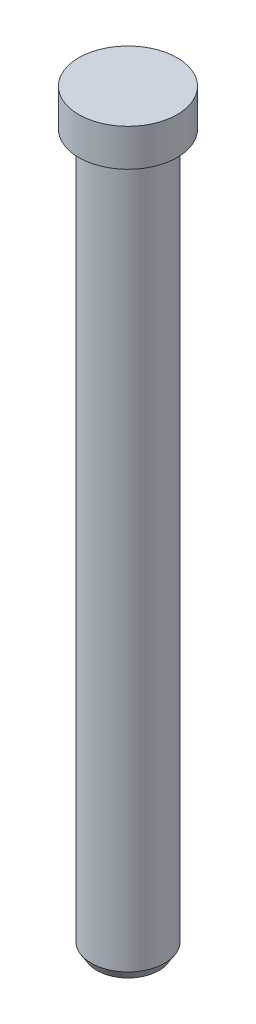
ISO-10303-21;
HEADER;
FILE_DESCRIPTION(('STEP AP214'),'2;1');
FILE_NAME('part.step','',(''),(''),'','','');
FILE_SCHEMA(('AUTOMOTIVE_DESIGN { 1 0 10303 214 1 1 1 1 }'));
ENDSEC;
DATA;
#1=APPLICATION_CONTEXT('core data for automotive mechanical design processes');
#2=APPLICATION_PROTOCOL_DEFINITION('international standard','automotive_design',2000,#1);
#3=PRODUCT_CONTEXT('',#1,'mechanical');
#4=PRODUCT('Part','Part','',(#3));
#5=PRODUCT_RELATED_PRODUCT_CATEGORY('part','',(#4));
#6=PRODUCT_DEFINITION_FORMATION('','',#4);
#7=PRODUCT_DEFINITION_CONTEXT('part definition',#1,'design');
#8=PRODUCT_DEFINITION('design','',#6,#7);
#9=PRODUCT_DEFINITION_SHAPE('','',#8);
#10=(LENGTH_UNIT() NAMED_UNIT(*) SI_UNIT(.MILLI.,.METRE.));
#11=(NAMED_UNIT(*) PLANE_ANGLE_UNIT() SI_UNIT($,.RADIAN.));
#12=(NAMED_UNIT(*) SI_UNIT($,.STERADIAN.) SOLID_ANGLE_UNIT());
#13=UNCERTAINTY_MEASURE_WITH_UNIT(LENGTH_MEASURE(1.E-05),#10,'distance_accuracy_value','');
#14=(GEOMETRIC_REPRESENTATION_CONTEXT(3) GLOBAL_UNCERTAINTY_ASSIGNED_CONTEXT((#13)) GLOBAL_UNIT_ASSIGNED_CONTEXT((#10,
#11,#12)) REPRESENTATION_CONTEXT('',''));
#15=CARTESIAN_POINT('',(0.,0.,0.));
#16=DIRECTION('',(0.,0.,1.));
#17=DIRECTION('',(1.,0.,0.));
#18=AXIS2_PLACEMENT_3D('',#15,#16,#17);
#19=CARTESIAN_POINT('',(0.,60.5,0.));
#20=DIRECTION('',(0.,-1.,0.));
#21=DIRECTION('',(1.,0.,0.));
#22=AXIS2_PLACEMENT_3D('',#19,#20,#21);
#23=PLANE('',#22);
#24=CARTESIAN_POINT('',(0.,60.5,0.));
#25=DIRECTION('',(0.,1.,0.));
#26=DIRECTION('',(-1.,0.,0.));
#27=AXIS2_PLACEMENT_3D('',#24,#25,#26);
#28=CIRCLE('',#27,7.9375);
#29=CARTESIAN_POINT('',(-7.93750000000001,60.5,0.));
#30=VERTEX_POINT('',#29);
#31=EDGE_CURVE('E10',#30,#30,#28,.T.);
#32=ORIENTED_EDGE('',*,*,#31,.T.);
#33=EDGE_LOOP('',(#32));
#34=FACE_BOUND('',#33,.T.);
#35=ADVANCED_FACE('F34',(#34),#23,.F.);
#36=CARTESIAN_POINT('',(0.,60.5,0.));
#37=DIRECTION('',(0.,1.,0.));
#38=DIRECTION('',(-1.,0.,0.));
#39=AXIS2_PLACEMENT_3D('',#36,#37,#38);
#40=CYLINDRICAL_SURFACE('',#39,7.9375);
#41=ORIENTED_EDGE('',*,*,#31,.F.);
#42=EDGE_LOOP('',(#41));
#43=FACE_BOUND('',#42,.T.);
#44=CARTESIAN_POINT('',(0.,54.5,0.));
#45=DIRECTION('',(0.,1.,0.));
#46=DIRECTION('',(-1.,0.,0.));
#47=AXIS2_PLACEMENT_3D('',#44,#45,#46);
#48=CIRCLE('',#47,7.9375);
#49=CARTESIAN_POINT('',(-7.93750000000001,54.5,0.));
#50=VERTEX_POINT('',#49);
#51=EDGE_CURVE('E40',#50,#50,#48,.T.);
#52=ORIENTED_EDGE('',*,*,#51,.T.);
#53=EDGE_LOOP('',(#52));
#54=FACE_BOUND('',#53,.T.);
#55=ADVANCED_FACE('F69',(#43,#54),#40,.T.);
#56=CARTESIAN_POINT('',(7.93749999999999,54.5,0.));
#57=DIRECTION('',(0.,1.,0.));
#58=DIRECTION('',(-1.,0.,0.));
#59=AXIS2_PLACEMENT_3D('',#56,#57,#58);
#60=PLANE('',#59);
#61=ORIENTED_EDGE('',*,*,#51,.F.);
#62=EDGE_LOOP('',(#61));
#63=FACE_BOUND('',#62,.T.);
#64=CARTESIAN_POINT('',(0.,54.5,0.));
#65=DIRECTION('',(0.,1.,0.));
#66=DIRECTION('',(-1.,0.,0.));
#67=AXIS2_PLACEMENT_3D('',#64,#65,#66);
#68=CIRCLE('',#67,5.9375);
#69=CARTESIAN_POINT('',(-5.93750000000001,54.5,0.));
#70=VERTEX_POINT('',#69);
#71=EDGE_CURVE('E44',#70,#70,#68,.T.);
#72=ORIENTED_EDGE('',*,*,#71,.T.);
#73=EDGE_LOOP('',(#72));
#74=FACE_BOUND('',#73,.T.);
#75=ADVANCED_FACE('F73',(#63,#74),#60,.F.);
#76=CARTESIAN_POINT('',(0.,60.5,0.));
#77=DIRECTION('',(0.,1.,0.));
#78=DIRECTION('',(-1.,0.,0.));
#79=AXIS2_PLACEMENT_3D('',#76,#77,#78);
#80=CYLINDRICAL_SURFACE('',#79,5.9375);
#81=ORIENTED_EDGE('',*,*,#71,.F.);
#82=EDGE_LOOP('',(#81));
#83=FACE_BOUND('',#82,.T.);
#84=CARTESIAN_POINT('',(0.,-59.,0.));
#85=DIRECTION('',(0.,1.,0.));
#86=DIRECTION('',(-1.,0.,0.));
#87=AXIS2_PLACEMENT_3D('',#84,#85,#86);
#88=CIRCLE('',#87,5.9375);
#89=CARTESIAN_POINT('',(-5.9375,-59.,0.));
#90=VERTEX_POINT('',#89);
#91=EDGE_CURVE('E48',#90,#90,#88,.T.);
#92=ORIENTED_EDGE('',*,*,#91,.T.);
#93=EDGE_LOOP('',(#92));
#94=FACE_BOUND('',#93,.T.);
#95=ADVANCED_FACE('F65',(#83,#94),#80,.T.);
#96=CARTESIAN_POINT('',(0.,-60.5,0.));
#97=DIRECTION('',(0.,1.,0.));
#98=DIRECTION('',(-1.,0.,0.));
#99=AXIS2_PLACEMENT_3D('',#96,#97,#98);
#100=CONICAL_SURFACE('',#99,5.00000000000001,0.558599315343559);
#101=ORIENTED_EDGE('',*,*,#91,.F.);
#102=EDGE_LOOP('',(#101));
#103=FACE_BOUND('',#102,.T.);
#104=CARTESIAN_POINT('',(0.,-60.5,0.));
#105=DIRECTION('',(0.,1.,0.));
#106=DIRECTION('',(-1.,0.,0.));
#107=AXIS2_PLACEMENT_3D('',#104,#105,#106);
#108=CIRCLE('',#107,5.00000000000001);
#109=CARTESIAN_POINT('',(-5.,-60.5,0.));
#110=VERTEX_POINT('',#109);
#111=EDGE_CURVE('E53',#110,#110,#108,.T.);
#112=ORIENTED_EDGE('',*,*,#111,.T.);
#113=EDGE_LOOP('',(#112));
#114=FACE_BOUND('',#113,.T.);
#115=ADVANCED_FACE('F57',(#103,#114),#100,.T.);
#116=CARTESIAN_POINT('',(5.00000000000001,-60.5,0.));
#117=DIRECTION('',(0.,1.,0.));
#118=DIRECTION('',(-1.,0.,0.));
#119=AXIS2_PLACEMENT_3D('',#116,#117,#118);
#120=PLANE('',#119);
#121=ORIENTED_EDGE('',*,*,#111,.F.);
#122=EDGE_LOOP('',(#121));
#123=FACE_BOUND('',#122,.T.);
#124=ADVANCED_FACE('F59',(#123),#120,.F.);
#125=CLOSED_SHELL('',(#35,#55,#75,#95,#115,#124));
#126=MANIFOLD_SOLID_BREP('B2',#125);
#127=ADVANCED_BREP_SHAPE_REPRESENTATION('',(#18,#126),#14);
#128=SHAPE_DEFINITION_REPRESENTATION(#9,#127);
ENDSEC;
END-ISO-10303-21;
